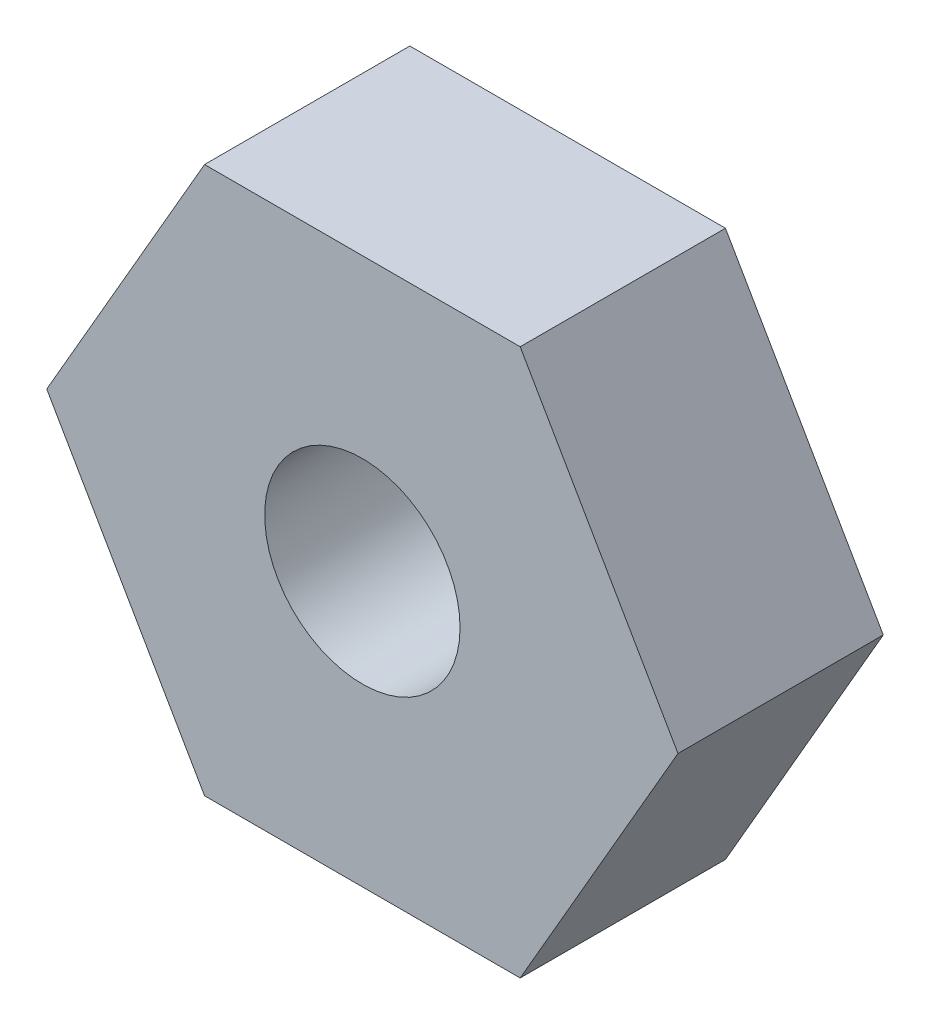
ISO-10303-21;
HEADER;
FILE_DESCRIPTION(('STEP AP214'),'2;1');
FILE_NAME('part.step','',(''),(''),'','','');
FILE_SCHEMA(('AUTOMOTIVE_DESIGN { 1 0 10303 214 1 1 1 1 }'));
ENDSEC;
DATA;
#1=APPLICATION_CONTEXT('core data for automotive mechanical design processes');
#2=APPLICATION_PROTOCOL_DEFINITION('international standard','automotive_design',2000,#1);
#3=PRODUCT_CONTEXT('',#1,'mechanical');
#4=PRODUCT('Part','Part','',(#3));
#5=PRODUCT_RELATED_PRODUCT_CATEGORY('part','',(#4));
#6=PRODUCT_DEFINITION_FORMATION('','',#4);
#7=PRODUCT_DEFINITION_CONTEXT('part definition',#1,'design');
#8=PRODUCT_DEFINITION('design','',#6,#7);
#9=PRODUCT_DEFINITION_SHAPE('','',#8);
#10=(LENGTH_UNIT() NAMED_UNIT(*) SI_UNIT(.MILLI.,.METRE.));
#11=(NAMED_UNIT(*) PLANE_ANGLE_UNIT() SI_UNIT($,.RADIAN.));
#12=(NAMED_UNIT(*) SI_UNIT($,.STERADIAN.) SOLID_ANGLE_UNIT());
#13=UNCERTAINTY_MEASURE_WITH_UNIT(LENGTH_MEASURE(1.E-05),#10,'distance_accuracy_value','');
#14=(GEOMETRIC_REPRESENTATION_CONTEXT(3) GLOBAL_UNCERTAINTY_ASSIGNED_CONTEXT((#13)) GLOBAL_UNIT_ASSIGNED_CONTEXT((#10,
#11,#12)) REPRESENTATION_CONTEXT('',''));
#15=CARTESIAN_POINT('',(0.,0.,0.));
#16=DIRECTION('',(0.,0.,1.));
#17=DIRECTION('',(1.,0.,0.));
#18=AXIS2_PLACEMENT_3D('',#15,#16,#17);
#19=CARTESIAN_POINT('',(1.82575475625834,-3.16230000000001,2.3749));
#20=DIRECTION('',(-0.866025403784438,0.5,0.));
#21=DIRECTION('',(-0.5,-0.866025403784438,0.));
#22=AXIS2_PLACEMENT_3D('',#19,#20,#21);
#23=PLANE('',#22);
#24=DIRECTION('',(0.5,0.866025403784438,0.));
#25=VECTOR('',#24,1.);
#26=CARTESIAN_POINT('',(1.82575475625834,-3.16230000000001,0.));
#27=LINE('',#26,#25);
#28=CARTESIAN_POINT('',(1.82575475625834,-3.16230000000001,0.));
#29=VERTEX_POINT('',#28);
#30=CARTESIAN_POINT('',(3.6515095125167,0.,0.));
#31=VERTEX_POINT('',#30);
#32=EDGE_CURVE('E119',#29,#31,#27,.T.);
#33=ORIENTED_EDGE('',*,*,#32,.T.);
#34=DIRECTION('',(0.,0.,-1.));
#35=VECTOR('',#34,1.);
#36=CARTESIAN_POINT('',(3.6515095125167,0.,2.3749));
#37=LINE('',#36,#35);
#38=CARTESIAN_POINT('',(3.6515095125167,0.,2.3749));
#39=VERTEX_POINT('',#38);
#40=EDGE_CURVE('E11',#39,#31,#37,.T.);
#41=ORIENTED_EDGE('',*,*,#40,.F.);
#42=DIRECTION('',(0.5,0.866025403784438,0.));
#43=VECTOR('',#42,1.);
#44=CARTESIAN_POINT('',(1.82575475625834,-3.16230000000001,2.3749));
#45=LINE('',#44,#43);
#46=CARTESIAN_POINT('',(1.82575475625834,-3.16230000000001,2.3749));
#47=VERTEX_POINT('',#46);
#48=EDGE_CURVE('E130',#47,#39,#45,.T.);
#49=ORIENTED_EDGE('',*,*,#48,.F.);
#50=DIRECTION('',(0.,0.,-1.));
#51=VECTOR('',#50,1.);
#52=CARTESIAN_POINT('',(1.82575475625834,-3.16230000000001,2.3749));
#53=LINE('',#52,#51);
#54=EDGE_CURVE('E115',#47,#29,#53,.T.);
#55=ORIENTED_EDGE('',*,*,#54,.T.);
#56=EDGE_LOOP('',(#33,#41,#49,#55));
#57=FACE_BOUND('',#56,.T.);
#58=ADVANCED_FACE('F35',(#57),#23,.F.);
#59=CARTESIAN_POINT('',(3.6515095125167,0.,2.3749));
#60=DIRECTION('',(-0.866025403784439,-0.5,0.));
#61=DIRECTION('',(0.5,-0.866025403784439,0.));
#62=AXIS2_PLACEMENT_3D('',#59,#60,#61);
#63=PLANE('',#62);
#64=DIRECTION('',(-0.5,0.866025403784439,0.));
#65=VECTOR('',#64,1.);
#66=CARTESIAN_POINT('',(3.6515095125167,0.,0.));
#67=LINE('',#66,#65);
#68=CARTESIAN_POINT('',(1.82575475625833,3.16230000000003,0.));
#69=VERTEX_POINT('',#68);
#70=EDGE_CURVE('E122',#31,#69,#67,.T.);
#71=ORIENTED_EDGE('',*,*,#70,.T.);
#72=DIRECTION('',(0.,0.,-1.));
#73=VECTOR('',#72,1.);
#74=CARTESIAN_POINT('',(1.82575475625833,3.16230000000003,2.3749));
#75=LINE('',#74,#73);
#76=CARTESIAN_POINT('',(1.82575475625833,3.16230000000003,2.3749));
#77=VERTEX_POINT('',#76);
#78=EDGE_CURVE('E43',#77,#69,#75,.T.);
#79=ORIENTED_EDGE('',*,*,#78,.F.);
#80=DIRECTION('',(-0.5,0.866025403784439,0.));
#81=VECTOR('',#80,1.);
#82=CARTESIAN_POINT('',(3.6515095125167,0.,2.3749));
#83=LINE('',#82,#81);
#84=EDGE_CURVE('E88',#39,#77,#83,.T.);
#85=ORIENTED_EDGE('',*,*,#84,.F.);
#86=ORIENTED_EDGE('',*,*,#40,.T.);
#87=EDGE_LOOP('',(#71,#79,#85,#86));
#88=FACE_BOUND('',#87,.T.);
#89=ADVANCED_FACE('F155',(#88),#63,.F.);
#90=CARTESIAN_POINT('',(1.82575475625833,3.16230000000003,2.3749));
#91=DIRECTION('',(0.,-1.,0.));
#92=DIRECTION('',(0.,0.,-1.));
#93=AXIS2_PLACEMENT_3D('',#90,#91,#92);
#94=PLANE('',#93);
#95=DIRECTION('',(-1.,0.,0.));
#96=VECTOR('',#95,1.);
#97=CARTESIAN_POINT('',(1.82575475625833,3.16230000000003,0.));
#98=LINE('',#97,#96);
#99=CARTESIAN_POINT('',(-1.82575475625836,3.16230000000003,0.));
#100=VERTEX_POINT('',#99);
#101=EDGE_CURVE('E125',#69,#100,#98,.T.);
#102=ORIENTED_EDGE('',*,*,#101,.T.);
#103=DIRECTION('',(0.,0.,-1.));
#104=VECTOR('',#103,1.);
#105=CARTESIAN_POINT('',(-1.82575475625836,3.16230000000003,2.3749));
#106=LINE('',#105,#104);
#107=CARTESIAN_POINT('',(-1.82575475625836,3.16230000000003,2.3749));
#108=VERTEX_POINT('',#107);
#109=EDGE_CURVE('E110',#108,#100,#106,.T.);
#110=ORIENTED_EDGE('',*,*,#109,.F.);
#111=DIRECTION('',(-1.,0.,0.));
#112=VECTOR('',#111,1.);
#113=CARTESIAN_POINT('',(1.82575475625833,3.16230000000003,2.3749));
#114=LINE('',#113,#112);
#115=EDGE_CURVE('E101',#77,#108,#114,.T.);
#116=ORIENTED_EDGE('',*,*,#115,.F.);
#117=ORIENTED_EDGE('',*,*,#78,.T.);
#118=EDGE_LOOP('',(#102,#110,#116,#117));
#119=FACE_BOUND('',#118,.T.);
#120=ADVANCED_FACE('F136',(#119),#94,.F.);
#121=CARTESIAN_POINT('',(-1.82575475625836,3.16230000000003,2.3749));
#122=DIRECTION('',(0.866025403784439,-0.5,0.));
#123=DIRECTION('',(0.5,0.866025403784439,0.));
#124=AXIS2_PLACEMENT_3D('',#121,#122,#123);
#125=PLANE('',#124);
#126=DIRECTION('',(-0.5,-0.866025403784439,0.));
#127=VECTOR('',#126,1.);
#128=CARTESIAN_POINT('',(-1.82575475625836,3.16230000000003,0.));
#129=LINE('',#128,#127);
#130=CARTESIAN_POINT('',(-3.65150951251673,0.,0.));
#131=VERTEX_POINT('',#130);
#132=EDGE_CURVE('E109',#100,#131,#129,.T.);
#133=ORIENTED_EDGE('',*,*,#132,.T.);
#134=DIRECTION('',(0.,0.,-1.));
#135=VECTOR('',#134,1.);
#136=CARTESIAN_POINT('',(-3.65150951251673,0.,2.3749));
#137=LINE('',#136,#135);
#138=CARTESIAN_POINT('',(-3.65150951251673,0.,2.3749));
#139=VERTEX_POINT('',#138);
#140=EDGE_CURVE('E106',#139,#131,#137,.T.);
#141=ORIENTED_EDGE('',*,*,#140,.F.);
#142=DIRECTION('',(-0.5,-0.866025403784439,0.));
#143=VECTOR('',#142,1.);
#144=CARTESIAN_POINT('',(-1.82575475625836,3.16230000000003,2.3749));
#145=LINE('',#144,#143);
#146=EDGE_CURVE('E95',#108,#139,#145,.T.);
#147=ORIENTED_EDGE('',*,*,#146,.F.);
#148=ORIENTED_EDGE('',*,*,#109,.T.);
#149=EDGE_LOOP('',(#133,#141,#147,#148));
#150=FACE_BOUND('',#149,.T.);
#151=ADVANCED_FACE('F107',(#150),#125,.F.);
#152=CARTESIAN_POINT('',(-3.65150951251673,0.,2.3749));
#153=DIRECTION('',(0.866025403784438,0.500000000000001,0.));
#154=DIRECTION('',(-0.500000000000001,0.866025403784438,0.));
#155=AXIS2_PLACEMENT_3D('',#152,#153,#154);
#156=PLANE('',#155);
#157=DIRECTION('',(0.500000000000001,-0.866025403784438,0.));
#158=VECTOR('',#157,1.);
#159=CARTESIAN_POINT('',(-3.65150951251673,0.,0.));
#160=LINE('',#159,#158);
#161=CARTESIAN_POINT('',(-1.82575475625837,-3.16230000000001,0.));
#162=VERTEX_POINT('',#161);
#163=EDGE_CURVE('E74',#131,#162,#160,.T.);
#164=ORIENTED_EDGE('',*,*,#163,.T.);
#165=DIRECTION('',(0.,0.,-1.));
#166=VECTOR('',#165,1.);
#167=CARTESIAN_POINT('',(-1.82575475625837,-3.16230000000001,2.3749));
#168=LINE('',#167,#166);
#169=CARTESIAN_POINT('',(-1.82575475625837,-3.16230000000001,2.3749));
#170=VERTEX_POINT('',#169);
#171=EDGE_CURVE('E111',#170,#162,#168,.T.);
#172=ORIENTED_EDGE('',*,*,#171,.F.);
#173=DIRECTION('',(0.500000000000001,-0.866025403784438,0.));
#174=VECTOR('',#173,1.);
#175=CARTESIAN_POINT('',(-3.65150951251673,0.,2.3749));
#176=LINE('',#175,#174);
#177=EDGE_CURVE('E99',#139,#170,#176,.T.);
#178=ORIENTED_EDGE('',*,*,#177,.F.);
#179=ORIENTED_EDGE('',*,*,#140,.T.);
#180=EDGE_LOOP('',(#164,#172,#178,#179));
#181=FACE_BOUND('',#180,.T.);
#182=ADVANCED_FACE('F113',(#181),#156,.F.);
#183=CARTESIAN_POINT('',(-1.82575475625837,-3.16230000000001,2.3749));
#184=DIRECTION('',(0.,1.,0.));
#185=DIRECTION('',(0.,0.,1.));
#186=AXIS2_PLACEMENT_3D('',#183,#184,#185);
#187=PLANE('',#186);
#188=DIRECTION('',(1.,0.,0.));
#189=VECTOR('',#188,1.);
#190=CARTESIAN_POINT('',(-1.82575475625837,-3.16230000000001,0.));
#191=LINE('',#190,#189);
#192=EDGE_CURVE('E80',#162,#29,#191,.T.);
#193=ORIENTED_EDGE('',*,*,#192,.T.);
#194=ORIENTED_EDGE('',*,*,#54,.F.);
#195=DIRECTION('',(1.,0.,0.));
#196=VECTOR('',#195,1.);
#197=CARTESIAN_POINT('',(-1.82575475625837,-3.16230000000001,2.3749));
#198=LINE('',#197,#196);
#199=EDGE_CURVE('E51',#170,#47,#198,.T.);
#200=ORIENTED_EDGE('',*,*,#199,.F.);
#201=ORIENTED_EDGE('',*,*,#171,.T.);
#202=EDGE_LOOP('',(#193,#194,#200,#201));
#203=FACE_BOUND('',#202,.T.);
#204=ADVANCED_FACE('F143',(#203),#187,.F.);
#205=CARTESIAN_POINT('',(0.,0.,2.3749));
#206=DIRECTION('',(0.,0.,1.));
#207=DIRECTION('',(1.,0.,0.));
#208=AXIS2_PLACEMENT_3D('',#205,#206,#207);
#209=PLANE('',#208);
#210=CARTESIAN_POINT('',(0.,0.,2.3749));
#211=DIRECTION('',(0.,0.,1.));
#212=DIRECTION('',(1.,0.,0.));
#213=AXIS2_PLACEMENT_3D('',#210,#211,#212);
#214=CIRCLE('',#213,1.1303);
#215=CARTESIAN_POINT('',(1.1303,0.,2.3749));
#216=VERTEX_POINT('',#215);
#217=EDGE_CURVE('E242',#216,#216,#214,.T.);
#218=ORIENTED_EDGE('',*,*,#217,.F.);
#219=EDGE_LOOP('',(#218));
#220=FACE_BOUND('',#219,.T.);
#221=ORIENTED_EDGE('',*,*,#48,.T.);
#222=ORIENTED_EDGE('',*,*,#84,.T.);
#223=ORIENTED_EDGE('',*,*,#115,.T.);
#224=ORIENTED_EDGE('',*,*,#146,.T.);
#225=ORIENTED_EDGE('',*,*,#177,.T.);
#226=ORIENTED_EDGE('',*,*,#199,.T.);
#227=EDGE_LOOP('',(#221,#222,#223,#224,#225,#226));
#228=FACE_BOUND('',#227,.T.);
#229=ADVANCED_FACE('F97',(#220,#228),#209,.T.);
#230=CARTESIAN_POINT('',(0.,0.,0.));
#231=DIRECTION('',(0.,0.,1.));
#232=DIRECTION('',(1.,0.,0.));
#233=AXIS2_PLACEMENT_3D('',#230,#231,#232);
#234=PLANE('',#233);
#235=CARTESIAN_POINT('',(0.,0.,0.));
#236=DIRECTION('',(0.,0.,1.));
#237=DIRECTION('',(1.,0.,0.));
#238=AXIS2_PLACEMENT_3D('',#235,#236,#237);
#239=CIRCLE('',#238,1.1303);
#240=CARTESIAN_POINT('',(1.1303,0.,0.));
#241=VERTEX_POINT('',#240);
#242=EDGE_CURVE('E123',#241,#241,#239,.F.);
#243=ORIENTED_EDGE('',*,*,#242,.F.);
#244=EDGE_LOOP('',(#243));
#245=FACE_BOUND('',#244,.T.);
#246=ORIENTED_EDGE('',*,*,#32,.F.);
#247=ORIENTED_EDGE('',*,*,#192,.F.);
#248=ORIENTED_EDGE('',*,*,#163,.F.);
#249=ORIENTED_EDGE('',*,*,#132,.F.);
#250=ORIENTED_EDGE('',*,*,#101,.F.);
#251=ORIENTED_EDGE('',*,*,#70,.F.);
#252=EDGE_LOOP('',(#246,#247,#248,#249,#250,#251));
#253=FACE_BOUND('',#252,.T.);
#254=ADVANCED_FACE('F139',(#245,#253),#234,.F.);
#255=CARTESIAN_POINT('',(0.,0.,-3.19697117910062));
#256=DIRECTION('',(0.,0.,1.));
#257=DIRECTION('',(1.,0.,0.));
#258=AXIS2_PLACEMENT_3D('',#255,#256,#257);
#259=CYLINDRICAL_SURFACE('',#258,1.1303);
#260=ORIENTED_EDGE('',*,*,#242,.T.);
#261=EDGE_LOOP('',(#260));
#262=FACE_BOUND('',#261,.T.);
#263=ORIENTED_EDGE('',*,*,#217,.T.);
#264=EDGE_LOOP('',(#263));
#265=FACE_BOUND('',#264,.T.);
#266=ADVANCED_FACE('F211',(#262,#265),#259,.F.);
#267=CLOSED_SHELL('',(#58,#89,#120,#151,#182,#204,#229,#254,#266));
#268=MANIFOLD_SOLID_BREP('B2',#267);
#269=ADVANCED_BREP_SHAPE_REPRESENTATION('',(#18,#268),#14);
#270=SHAPE_DEFINITION_REPRESENTATION(#9,#269);
ENDSEC;
END-ISO-10303-21;
